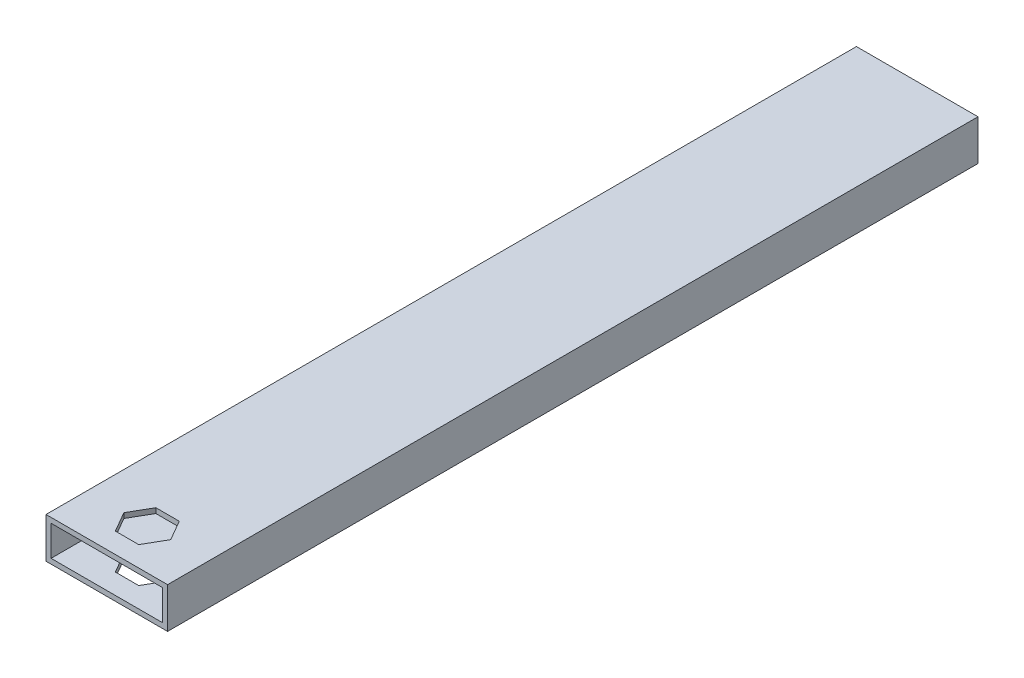
ISO-10303-21;
HEADER;
FILE_DESCRIPTION(('STEP AP214'),'2;1');
FILE_NAME('part.step','',(''),(''),'','','');
FILE_SCHEMA(('AUTOMOTIVE_DESIGN { 1 0 10303 214 1 1 1 1 }'));
ENDSEC;
DATA;
#1=APPLICATION_CONTEXT('core data for automotive mechanical design processes');
#2=APPLICATION_PROTOCOL_DEFINITION('international standard','automotive_design',2000,#1);
#3=PRODUCT_CONTEXT('',#1,'mechanical');
#4=PRODUCT('Part','Part','',(#3));
#5=PRODUCT_RELATED_PRODUCT_CATEGORY('part','',(#4));
#6=PRODUCT_DEFINITION_FORMATION('','',#4);
#7=PRODUCT_DEFINITION_CONTEXT('part definition',#1,'design');
#8=PRODUCT_DEFINITION('design','',#6,#7);
#9=PRODUCT_DEFINITION_SHAPE('','',#8);
#10=(LENGTH_UNIT() NAMED_UNIT(*) SI_UNIT(.MILLI.,.METRE.));
#11=(NAMED_UNIT(*) PLANE_ANGLE_UNIT() SI_UNIT($,.RADIAN.));
#12=(NAMED_UNIT(*) SI_UNIT($,.STERADIAN.) SOLID_ANGLE_UNIT());
#13=UNCERTAINTY_MEASURE_WITH_UNIT(LENGTH_MEASURE(1.E-05),#10,'distance_accuracy_value','');
#14=(GEOMETRIC_REPRESENTATION_CONTEXT(3) GLOBAL_UNCERTAINTY_ASSIGNED_CONTEXT((#13)) GLOBAL_UNIT_ASSIGNED_CONTEXT((#10,
#11,#12)) REPRESENTATION_CONTEXT('',''));
#15=CARTESIAN_POINT('',(0.,0.,0.));
#16=DIRECTION('',(0.,0.,1.));
#17=DIRECTION('',(1.,0.,0.));
#18=AXIS2_PLACEMENT_3D('',#15,#16,#17);
#19=CARTESIAN_POINT('',(0.,0.,254.));
#20=DIRECTION('',(1.,0.,0.));
#21=DIRECTION('',(0.,0.,-1.));
#22=AXIS2_PLACEMENT_3D('',#19,#20,#21);
#23=PLANE('',#22);
#24=DIRECTION('',(0.,-1.,0.));
#25=VECTOR('',#24,1.);
#26=CARTESIAN_POINT('',(0.,0.,0.));
#27=LINE('',#26,#25);
#28=CARTESIAN_POINT('',(0.,12.7,0.));
#29=VERTEX_POINT('',#28);
#30=CARTESIAN_POINT('',(0.,0.,0.));
#31=VERTEX_POINT('',#30);
#32=EDGE_CURVE('E279',#29,#31,#27,.T.);
#33=ORIENTED_EDGE('',*,*,#32,.T.);
#34=DIRECTION('',(0.,0.,-1.));
#35=VECTOR('',#34,1.);
#36=CARTESIAN_POINT('',(0.,0.,254.));
#37=LINE('',#36,#35);
#38=CARTESIAN_POINT('',(0.,0.,254.));
#39=VERTEX_POINT('',#38);
#40=EDGE_CURVE('E312',#39,#31,#37,.T.);
#41=ORIENTED_EDGE('',*,*,#40,.F.);
#42=DIRECTION('',(0.,-1.,0.));
#43=VECTOR('',#42,1.);
#44=CARTESIAN_POINT('',(0.,0.,254.));
#45=LINE('',#44,#43);
#46=CARTESIAN_POINT('',(0.,12.7,254.));
#47=VERTEX_POINT('',#46);
#48=EDGE_CURVE('E286',#47,#39,#45,.T.);
#49=ORIENTED_EDGE('',*,*,#48,.F.);
#50=DIRECTION('',(0.,0.,-1.));
#51=VECTOR('',#50,1.);
#52=CARTESIAN_POINT('',(0.,12.7,254.));
#53=LINE('',#52,#51);
#54=EDGE_CURVE('E296',#47,#29,#53,.T.);
#55=ORIENTED_EDGE('',*,*,#54,.T.);
#56=EDGE_LOOP('',(#33,#41,#49,#55));
#57=FACE_BOUND('',#56,.T.);
#58=ADVANCED_FACE('F34',(#57),#23,.F.);
#59=CARTESIAN_POINT('',(0.,0.,254.));
#60=DIRECTION('',(0.,1.,0.));
#61=DIRECTION('',(0.,0.,1.));
#62=AXIS2_PLACEMENT_3D('',#59,#60,#61);
#63=PLANE('',#62);
#64=DIRECTION('',(-0.499999999999999,0.,0.866025403784439));
#65=VECTOR('',#64,1.);
#66=CARTESIAN_POINT('',(26.3823484187083,0.,241.3));
#67=LINE('',#66,#65);
#68=CARTESIAN_POINT('',(26.3823484187083,0.,241.3));
#69=VERTEX_POINT('',#68);
#70=CARTESIAN_POINT('',(22.7161742093541,0.,247.65));
#71=VERTEX_POINT('',#70);
#72=EDGE_CURVE('E211',#69,#71,#67,.T.);
#73=ORIENTED_EDGE('',*,*,#72,.F.);
#74=DIRECTION('',(0.5,0.,0.866025403784439));
#75=VECTOR('',#74,1.);
#76=CARTESIAN_POINT('',(22.7161742093542,0.,234.95));
#77=LINE('',#76,#75);
#78=CARTESIAN_POINT('',(22.7161742093542,0.,234.95));
#79=VERTEX_POINT('',#78);
#80=EDGE_CURVE('E48',#79,#69,#77,.T.);
#81=ORIENTED_EDGE('',*,*,#80,.F.);
#82=DIRECTION('',(1.,0.,0.));
#83=VECTOR('',#82,1.);
#84=CARTESIAN_POINT('',(15.3838257906459,0.,234.95));
#85=LINE('',#84,#83);
#86=CARTESIAN_POINT('',(15.3838257906459,0.,234.95));
#87=VERTEX_POINT('',#86);
#88=EDGE_CURVE('E197',#87,#79,#85,.T.);
#89=ORIENTED_EDGE('',*,*,#88,.F.);
#90=DIRECTION('',(0.5,0.,-0.866025403784438));
#91=VECTOR('',#90,1.);
#92=CARTESIAN_POINT('',(11.7176515812918,0.,241.3));
#93=LINE('',#92,#91);
#94=CARTESIAN_POINT('',(11.7176515812918,0.,241.3));
#95=VERTEX_POINT('',#94);
#96=EDGE_CURVE('E200',#95,#87,#93,.T.);
#97=ORIENTED_EDGE('',*,*,#96,.F.);
#98=DIRECTION('',(-0.499999999999999,0.,-0.866025403784439));
#99=VECTOR('',#98,1.);
#100=CARTESIAN_POINT('',(15.3838257906459,0.,247.65));
#101=LINE('',#100,#99);
#102=CARTESIAN_POINT('',(15.3838257906459,0.,247.65));
#103=VERTEX_POINT('',#102);
#104=EDGE_CURVE('E217',#103,#95,#101,.T.);
#105=ORIENTED_EDGE('',*,*,#104,.F.);
#106=DIRECTION('',(-1.,0.,0.));
#107=VECTOR('',#106,1.);
#108=CARTESIAN_POINT('',(22.7161742093541,0.,247.65));
#109=LINE('',#108,#107);
#110=EDGE_CURVE('E214',#71,#103,#109,.T.);
#111=ORIENTED_EDGE('',*,*,#110,.F.);
#112=EDGE_LOOP('',(#73,#81,#89,#97,#105,#111));
#113=FACE_BOUND('',#112,.T.);
#114=DIRECTION('',(1.,0.,0.));
#115=VECTOR('',#114,1.);
#116=CARTESIAN_POINT('',(0.,0.,0.));
#117=LINE('',#116,#115);
#118=CARTESIAN_POINT('',(38.1,0.,0.));
#119=VERTEX_POINT('',#118);
#120=EDGE_CURVE('E299',#31,#119,#117,.T.);
#121=ORIENTED_EDGE('',*,*,#120,.T.);
#122=DIRECTION('',(0.,0.,-1.));
#123=VECTOR('',#122,1.);
#124=CARTESIAN_POINT('',(38.1,0.,254.));
#125=LINE('',#124,#123);
#126=CARTESIAN_POINT('',(38.1,0.,254.));
#127=VERTEX_POINT('',#126);
#128=EDGE_CURVE('E309',#127,#119,#125,.T.);
#129=ORIENTED_EDGE('',*,*,#128,.F.);
#130=DIRECTION('',(1.,0.,0.));
#131=VECTOR('',#130,1.);
#132=CARTESIAN_POINT('',(0.,0.,254.));
#133=LINE('',#132,#131);
#134=EDGE_CURVE('E289',#39,#127,#133,.T.);
#135=ORIENTED_EDGE('',*,*,#134,.F.);
#136=ORIENTED_EDGE('',*,*,#40,.T.);
#137=EDGE_LOOP('',(#121,#129,#135,#136));
#138=FACE_BOUND('',#137,.T.);
#139=ADVANCED_FACE('F342',(#113,#138),#63,.F.);
#140=CARTESIAN_POINT('',(38.1,0.,254.));
#141=DIRECTION('',(-1.,0.,0.));
#142=DIRECTION('',(0.,0.,1.));
#143=AXIS2_PLACEMENT_3D('',#140,#141,#142);
#144=PLANE('',#143);
#145=DIRECTION('',(0.,1.,0.));
#146=VECTOR('',#145,1.);
#147=CARTESIAN_POINT('',(38.1,0.,0.));
#148=LINE('',#147,#146);
#149=CARTESIAN_POINT('',(38.1,12.7,0.));
#150=VERTEX_POINT('',#149);
#151=EDGE_CURVE('E301',#119,#150,#148,.T.);
#152=ORIENTED_EDGE('',*,*,#151,.T.);
#153=DIRECTION('',(0.,0.,-1.));
#154=VECTOR('',#153,1.);
#155=CARTESIAN_POINT('',(38.1,12.7,254.));
#156=LINE('',#155,#154);
#157=CARTESIAN_POINT('',(38.1,12.7,254.));
#158=VERTEX_POINT('',#157);
#159=EDGE_CURVE('E306',#158,#150,#156,.T.);
#160=ORIENTED_EDGE('',*,*,#159,.F.);
#161=DIRECTION('',(0.,1.,0.));
#162=VECTOR('',#161,1.);
#163=CARTESIAN_POINT('',(38.1,0.,254.));
#164=LINE('',#163,#162);
#165=EDGE_CURVE('E292',#127,#158,#164,.T.);
#166=ORIENTED_EDGE('',*,*,#165,.F.);
#167=ORIENTED_EDGE('',*,*,#128,.T.);
#168=EDGE_LOOP('',(#152,#160,#166,#167));
#169=FACE_BOUND('',#168,.T.);
#170=ADVANCED_FACE('F364',(#169),#144,.F.);
#171=CARTESIAN_POINT('',(0.,12.7,254.));
#172=DIRECTION('',(0.,-1.,0.));
#173=DIRECTION('',(0.,0.,-1.));
#174=AXIS2_PLACEMENT_3D('',#171,#172,#173);
#175=PLANE('',#174);
#176=DIRECTION('',(1.,0.,0.));
#177=VECTOR('',#176,1.);
#178=CARTESIAN_POINT('',(15.3838257906459,12.7,234.95));
#179=LINE('',#178,#177);
#180=CARTESIAN_POINT('',(15.3838257906459,12.7,234.95));
#181=VERTEX_POINT('',#180);
#182=CARTESIAN_POINT('',(22.7161742093542,12.7,234.95));
#183=VERTEX_POINT('',#182);
#184=EDGE_CURVE('E196',#181,#183,#179,.T.);
#185=ORIENTED_EDGE('',*,*,#184,.T.);
#186=DIRECTION('',(0.5,0.,0.866025403784439));
#187=VECTOR('',#186,1.);
#188=CARTESIAN_POINT('',(22.7161742093542,12.7,234.95));
#189=LINE('',#188,#187);
#190=CARTESIAN_POINT('',(26.3823484187083,12.7,241.3));
#191=VERTEX_POINT('',#190);
#192=EDGE_CURVE('E177',#183,#191,#189,.T.);
#193=ORIENTED_EDGE('',*,*,#192,.T.);
#194=DIRECTION('',(-0.499999999999999,0.,0.866025403784439));
#195=VECTOR('',#194,1.);
#196=CARTESIAN_POINT('',(26.3823484187083,12.7,241.3));
#197=LINE('',#196,#195);
#198=CARTESIAN_POINT('',(22.7161742093541,12.7,247.65));
#199=VERTEX_POINT('',#198);
#200=EDGE_CURVE('E187',#191,#199,#197,.T.);
#201=ORIENTED_EDGE('',*,*,#200,.T.);
#202=DIRECTION('',(-1.,0.,0.));
#203=VECTOR('',#202,1.);
#204=CARTESIAN_POINT('',(22.7161742093541,12.7,247.65));
#205=LINE('',#204,#203);
#206=CARTESIAN_POINT('',(15.3838257906459,12.7,247.65));
#207=VERTEX_POINT('',#206);
#208=EDGE_CURVE('E56',#199,#207,#205,.T.);
#209=ORIENTED_EDGE('',*,*,#208,.T.);
#210=DIRECTION('',(-0.499999999999999,0.,-0.866025403784439));
#211=VECTOR('',#210,1.);
#212=CARTESIAN_POINT('',(15.3838257906459,12.7,247.65));
#213=LINE('',#212,#211);
#214=CARTESIAN_POINT('',(11.7176515812918,12.7,241.3));
#215=VERTEX_POINT('',#214);
#216=EDGE_CURVE('E204',#207,#215,#213,.T.);
#217=ORIENTED_EDGE('',*,*,#216,.T.);
#218=DIRECTION('',(0.5,0.,-0.866025403784438));
#219=VECTOR('',#218,1.);
#220=CARTESIAN_POINT('',(11.7176515812918,12.7,241.3));
#221=LINE('',#220,#219);
#222=EDGE_CURVE('E207',#215,#181,#221,.T.);
#223=ORIENTED_EDGE('',*,*,#222,.T.);
#224=EDGE_LOOP('',(#185,#193,#201,#209,#217,#223));
#225=FACE_BOUND('',#224,.T.);
#226=DIRECTION('',(-1.,0.,0.));
#227=VECTOR('',#226,1.);
#228=CARTESIAN_POINT('',(0.,12.7,0.));
#229=LINE('',#228,#227);
#230=EDGE_CURVE('E290',#150,#29,#229,.T.);
#231=ORIENTED_EDGE('',*,*,#230,.T.);
#232=ORIENTED_EDGE('',*,*,#54,.F.);
#233=DIRECTION('',(-1.,0.,0.));
#234=VECTOR('',#233,1.);
#235=CARTESIAN_POINT('',(0.,12.7,254.));
#236=LINE('',#235,#234);
#237=EDGE_CURVE('E294',#158,#47,#236,.T.);
#238=ORIENTED_EDGE('',*,*,#237,.F.);
#239=ORIENTED_EDGE('',*,*,#159,.T.);
#240=EDGE_LOOP('',(#231,#232,#238,#239));
#241=FACE_BOUND('',#240,.T.);
#242=ADVANCED_FACE('F192',(#225,#241),#175,.F.);
#243=CARTESIAN_POINT('',(0.,0.,254.));
#244=DIRECTION('',(0.,0.,-1.));
#245=DIRECTION('',(-1.,0.,0.));
#246=AXIS2_PLACEMENT_3D('',#243,#244,#245);
#247=PLANE('',#246);
#248=DIRECTION('',(0.,-1.,0.));
#249=VECTOR('',#248,1.);
#250=CARTESIAN_POINT('',(1.5875,11.1125,254.));
#251=LINE('',#250,#249);
#252=CARTESIAN_POINT('',(1.5875,11.1125,254.));
#253=VERTEX_POINT('',#252);
#254=CARTESIAN_POINT('',(1.5875,1.5875,254.));
#255=VERTEX_POINT('',#254);
#256=EDGE_CURVE('E269',#253,#255,#251,.T.);
#257=ORIENTED_EDGE('',*,*,#256,.F.);
#258=DIRECTION('',(-1.,0.,0.));
#259=VECTOR('',#258,1.);
#260=CARTESIAN_POINT('',(36.5125,11.1125,254.));
#261=LINE('',#260,#259);
#262=CARTESIAN_POINT('',(36.5125,11.1125,254.));
#263=VERTEX_POINT('',#262);
#264=EDGE_CURVE('E253',#263,#253,#261,.T.);
#265=ORIENTED_EDGE('',*,*,#264,.F.);
#266=DIRECTION('',(0.,1.,0.));
#267=VECTOR('',#266,1.);
#268=CARTESIAN_POINT('',(36.5125,1.5875,254.));
#269=LINE('',#268,#267);
#270=CARTESIAN_POINT('',(36.5125,1.5875,254.));
#271=VERTEX_POINT('',#270);
#272=EDGE_CURVE('E258',#271,#263,#269,.T.);
#273=ORIENTED_EDGE('',*,*,#272,.F.);
#274=DIRECTION('',(1.,0.,0.));
#275=VECTOR('',#274,1.);
#276=CARTESIAN_POINT('',(1.5875,1.5875,254.));
#277=LINE('',#276,#275);
#278=EDGE_CURVE('E272',#255,#271,#277,.T.);
#279=ORIENTED_EDGE('',*,*,#278,.F.);
#280=EDGE_LOOP('',(#257,#265,#273,#279));
#281=FACE_BOUND('',#280,.T.);
#282=ORIENTED_EDGE('',*,*,#48,.T.);
#283=ORIENTED_EDGE('',*,*,#134,.T.);
#284=ORIENTED_EDGE('',*,*,#165,.T.);
#285=ORIENTED_EDGE('',*,*,#237,.T.);
#286=EDGE_LOOP('',(#282,#283,#284,#285));
#287=FACE_BOUND('',#286,.T.);
#288=ADVANCED_FACE('F376',(#281,#287),#247,.F.);
#289=CARTESIAN_POINT('',(0.,0.,0.));
#290=DIRECTION('',(0.,0.,-1.));
#291=DIRECTION('',(-1.,0.,0.));
#292=AXIS2_PLACEMENT_3D('',#289,#290,#291);
#293=PLANE('',#292);
#294=DIRECTION('',(-1.,0.,0.));
#295=VECTOR('',#294,1.);
#296=CARTESIAN_POINT('',(36.5125,11.1125,0.));
#297=LINE('',#296,#295);
#298=CARTESIAN_POINT('',(36.5125,11.1125,0.));
#299=VERTEX_POINT('',#298);
#300=CARTESIAN_POINT('',(1.5875,11.1125,0.));
#301=VERTEX_POINT('',#300);
#302=EDGE_CURVE('E254',#299,#301,#297,.T.);
#303=ORIENTED_EDGE('',*,*,#302,.T.);
#304=DIRECTION('',(0.,-1.,0.));
#305=VECTOR('',#304,1.);
#306=CARTESIAN_POINT('',(1.5875,11.1125,0.));
#307=LINE('',#306,#305);
#308=CARTESIAN_POINT('',(1.5875,1.5875,0.));
#309=VERTEX_POINT('',#308);
#310=EDGE_CURVE('E257',#301,#309,#307,.T.);
#311=ORIENTED_EDGE('',*,*,#310,.T.);
#312=DIRECTION('',(1.,0.,0.));
#313=VECTOR('',#312,1.);
#314=CARTESIAN_POINT('',(1.5875,1.5875,0.));
#315=LINE('',#314,#313);
#316=CARTESIAN_POINT('',(36.5125,1.5875,0.));
#317=VERTEX_POINT('',#316);
#318=EDGE_CURVE('E261',#309,#317,#315,.T.);
#319=ORIENTED_EDGE('',*,*,#318,.T.);
#320=DIRECTION('',(0.,1.,0.));
#321=VECTOR('',#320,1.);
#322=CARTESIAN_POINT('',(36.5125,1.5875,0.));
#323=LINE('',#322,#321);
#324=EDGE_CURVE('E264',#317,#299,#323,.T.);
#325=ORIENTED_EDGE('',*,*,#324,.T.);
#326=EDGE_LOOP('',(#303,#311,#319,#325));
#327=FACE_BOUND('',#326,.T.);
#328=ORIENTED_EDGE('',*,*,#32,.F.);
#329=ORIENTED_EDGE('',*,*,#230,.F.);
#330=ORIENTED_EDGE('',*,*,#151,.F.);
#331=ORIENTED_EDGE('',*,*,#120,.F.);
#332=EDGE_LOOP('',(#328,#329,#330,#331));
#333=FACE_BOUND('',#332,.T.);
#334=ADVANCED_FACE('F371',(#327,#333),#293,.T.);
#335=CARTESIAN_POINT('',(36.5125,11.1125,0.));
#336=DIRECTION('',(0.,1.,0.));
#337=DIRECTION('',(0.,0.,1.));
#338=AXIS2_PLACEMENT_3D('',#335,#336,#337);
#339=PLANE('',#338);
#340=DIRECTION('',(0.499999999999999,0.,-0.866025403784439));
#341=VECTOR('',#340,1.);
#342=CARTESIAN_POINT('',(133.400851280624,11.1125,55.938515693207));
#343=LINE('',#342,#341);
#344=CARTESIAN_POINT('',(22.7161742093541,11.1125,247.65));
#345=VERTEX_POINT('',#344);
#346=CARTESIAN_POINT('',(26.3823484187082,11.1125,241.3));
#347=VERTEX_POINT('',#346);
#348=EDGE_CURVE('E224',#345,#347,#343,.T.);
#349=ORIENTED_EDGE('',*,*,#348,.T.);
#350=DIRECTION('',(-0.5,0.,-0.866025403784439));
#351=VECTOR('',#350,1.);
#352=CARTESIAN_POINT('',(-75.5710786525614,11.1125,64.7114843067929));
#353=LINE('',#352,#351);
#354=CARTESIAN_POINT('',(22.7161742093542,11.1125,234.95));
#355=VERTEX_POINT('',#354);
#356=EDGE_CURVE('E180',#347,#355,#353,.T.);
#357=ORIENTED_EDGE('',*,*,#356,.T.);
#358=DIRECTION('',(-1.,0.,0.));
#359=VECTOR('',#358,1.);
#360=CARTESIAN_POINT('',(36.5125,11.1125,234.95));
#361=LINE('',#360,#359);
#362=CARTESIAN_POINT('',(15.3838257906459,11.1125,234.95));
#363=VERTEX_POINT('',#362);
#364=EDGE_CURVE('E249',#355,#363,#361,.T.);
#365=ORIENTED_EDGE('',*,*,#364,.T.);
#366=DIRECTION('',(-0.5,0.,0.866025403784439));
#367=VECTOR('',#366,1.);
#368=CARTESIAN_POINT('',(122.402328652561,11.1125,49.5885156932072));
#369=LINE('',#368,#367);
#370=CARTESIAN_POINT('',(11.7176515812918,11.1125,241.3));
#371=VERTEX_POINT('',#370);
#372=EDGE_CURVE('E246',#363,#371,#369,.T.);
#373=ORIENTED_EDGE('',*,*,#372,.T.);
#374=DIRECTION('',(0.499999999999999,0.,0.866025403784439));
#375=VECTOR('',#374,1.);
#376=CARTESIAN_POINT('',(-86.5696012806236,11.1125,71.0614843067926));
#377=LINE('',#376,#375);
#378=CARTESIAN_POINT('',(15.3838257906459,11.1125,247.65));
#379=VERTEX_POINT('',#378);
#380=EDGE_CURVE('E243',#371,#379,#377,.T.);
#381=ORIENTED_EDGE('',*,*,#380,.T.);
#382=DIRECTION('',(1.,0.,0.));
#383=VECTOR('',#382,1.);
#384=CARTESIAN_POINT('',(36.5125,11.1125,247.65));
#385=LINE('',#384,#383);
#386=EDGE_CURVE('E240',#379,#345,#385,.T.);
#387=ORIENTED_EDGE('',*,*,#386,.T.);
#388=EDGE_LOOP('',(#349,#357,#365,#373,#381,#387));
#389=FACE_BOUND('',#388,.T.);
#390=ORIENTED_EDGE('',*,*,#264,.T.);
#391=DIRECTION('',(0.,0.,1.));
#392=VECTOR('',#391,1.);
#393=CARTESIAN_POINT('',(1.5875,11.1125,0.));
#394=LINE('',#393,#392);
#395=EDGE_CURVE('E267',#301,#253,#394,.T.);
#396=ORIENTED_EDGE('',*,*,#395,.F.);
#397=ORIENTED_EDGE('',*,*,#302,.F.);
#398=DIRECTION('',(0.,0.,1.));
#399=VECTOR('',#398,1.);
#400=CARTESIAN_POINT('',(36.5125,11.1125,0.));
#401=LINE('',#400,#399);
#402=EDGE_CURVE('E277',#299,#263,#401,.T.);
#403=ORIENTED_EDGE('',*,*,#402,.T.);
#404=EDGE_LOOP('',(#390,#396,#397,#403));
#405=FACE_BOUND('',#404,.T.);
#406=ADVANCED_FACE('F389',(#389,#405),#339,.F.);
#407=CARTESIAN_POINT('',(36.5125,1.5875,0.));
#408=DIRECTION('',(1.,0.,0.));
#409=DIRECTION('',(0.,0.,-1.));
#410=AXIS2_PLACEMENT_3D('',#407,#408,#409);
#411=PLANE('',#410);
#412=ORIENTED_EDGE('',*,*,#272,.T.);
#413=ORIENTED_EDGE('',*,*,#402,.F.);
#414=ORIENTED_EDGE('',*,*,#324,.F.);
#415=DIRECTION('',(0.,0.,1.));
#416=VECTOR('',#415,1.);
#417=CARTESIAN_POINT('',(36.5125,1.5875,0.));
#418=LINE('',#417,#416);
#419=EDGE_CURVE('E280',#317,#271,#418,.T.);
#420=ORIENTED_EDGE('',*,*,#419,.T.);
#421=EDGE_LOOP('',(#412,#413,#414,#420));
#422=FACE_BOUND('',#421,.T.);
#423=ADVANCED_FACE('F396',(#422),#411,.F.);
#424=CARTESIAN_POINT('',(1.5875,1.5875,0.));
#425=DIRECTION('',(0.,-1.,0.));
#426=DIRECTION('',(0.,0.,-1.));
#427=AXIS2_PLACEMENT_3D('',#424,#425,#426);
#428=PLANE('',#427);
#429=DIRECTION('',(1.,0.,0.));
#430=VECTOR('',#429,1.);
#431=CARTESIAN_POINT('',(1.5875,1.5875,234.95));
#432=LINE('',#431,#430);
#433=CARTESIAN_POINT('',(15.3838257906459,1.5875,234.95));
#434=VERTEX_POINT('',#433);
#435=CARTESIAN_POINT('',(22.7161742093542,1.5875,234.95));
#436=VERTEX_POINT('',#435);
#437=EDGE_CURVE('E41',#434,#436,#432,.T.);
#438=ORIENTED_EDGE('',*,*,#437,.T.);
#439=DIRECTION('',(0.5,0.,0.866025403784439));
#440=VECTOR('',#439,1.);
#441=CARTESIAN_POINT('',(-84.3023286525614,1.5875,49.5885156932072));
#442=LINE('',#441,#440);
#443=CARTESIAN_POINT('',(26.3823484187083,1.5875,241.3));
#444=VERTEX_POINT('',#443);
#445=EDGE_CURVE('E11',#436,#444,#442,.T.);
#446=ORIENTED_EDGE('',*,*,#445,.T.);
#447=DIRECTION('',(-0.499999999999999,0.,0.866025403784439));
#448=VECTOR('',#447,1.);
#449=CARTESIAN_POINT('',(124.669601280624,1.5875,71.0614843067927));
#450=LINE('',#449,#448);
#451=CARTESIAN_POINT('',(22.7161742093542,1.5875,247.65));
#452=VERTEX_POINT('',#451);
#453=EDGE_CURVE('E315',#444,#452,#450,.T.);
#454=ORIENTED_EDGE('',*,*,#453,.T.);
#455=DIRECTION('',(-1.,0.,0.));
#456=VECTOR('',#455,1.);
#457=CARTESIAN_POINT('',(1.5875,1.5875,247.65));
#458=LINE('',#457,#456);
#459=CARTESIAN_POINT('',(15.3838257906459,1.5875,247.65));
#460=VERTEX_POINT('',#459);
#461=EDGE_CURVE('E318',#452,#460,#458,.T.);
#462=ORIENTED_EDGE('',*,*,#461,.T.);
#463=DIRECTION('',(-0.499999999999999,0.,-0.866025403784439));
#464=VECTOR('',#463,1.);
#465=CARTESIAN_POINT('',(-95.3008512806236,1.5875,55.9385156932069));
#466=LINE('',#465,#464);
#467=CARTESIAN_POINT('',(11.7176515812918,1.5875,241.3));
#468=VERTEX_POINT('',#467);
#469=EDGE_CURVE('E321',#460,#468,#466,.T.);
#470=ORIENTED_EDGE('',*,*,#469,.T.);
#471=DIRECTION('',(0.5,0.,-0.866025403784439));
#472=VECTOR('',#471,1.);
#473=CARTESIAN_POINT('',(113.671078652561,1.5875,64.711484306793));
#474=LINE('',#473,#472);
#475=EDGE_CURVE('E324',#468,#434,#474,.T.);
#476=ORIENTED_EDGE('',*,*,#475,.T.);
#477=EDGE_LOOP('',(#438,#446,#454,#462,#470,#476));
#478=FACE_BOUND('',#477,.T.);
#479=ORIENTED_EDGE('',*,*,#278,.T.);
#480=ORIENTED_EDGE('',*,*,#419,.F.);
#481=ORIENTED_EDGE('',*,*,#318,.F.);
#482=DIRECTION('',(0.,0.,1.));
#483=VECTOR('',#482,1.);
#484=CARTESIAN_POINT('',(1.5875,1.5875,0.));
#485=LINE('',#484,#483);
#486=EDGE_CURVE('E282',#309,#255,#485,.T.);
#487=ORIENTED_EDGE('',*,*,#486,.T.);
#488=EDGE_LOOP('',(#479,#480,#481,#487));
#489=FACE_BOUND('',#488,.T.);
#490=ADVANCED_FACE('F328',(#478,#489),#428,.F.);
#491=CARTESIAN_POINT('',(1.5875,11.1125,0.));
#492=DIRECTION('',(-1.,0.,0.));
#493=DIRECTION('',(0.,0.,1.));
#494=AXIS2_PLACEMENT_3D('',#491,#492,#493);
#495=PLANE('',#494);
#496=ORIENTED_EDGE('',*,*,#256,.T.);
#497=ORIENTED_EDGE('',*,*,#486,.F.);
#498=ORIENTED_EDGE('',*,*,#310,.F.);
#499=ORIENTED_EDGE('',*,*,#395,.T.);
#500=EDGE_LOOP('',(#496,#497,#498,#499));
#501=FACE_BOUND('',#500,.T.);
#502=ADVANCED_FACE('F398',(#501),#495,.F.);
#503=CARTESIAN_POINT('',(26.3823484187083,12.7,241.3));
#504=DIRECTION('',(0.866025403784439,0.,0.5));
#505=DIRECTION('',(0.499999999999999,0.,-0.866025403784439));
#506=AXIS2_PLACEMENT_3D('',#503,#504,#505);
#507=PLANE('',#506);
#508=DIRECTION('',(0.,-1.,0.));
#509=VECTOR('',#508,1.);
#510=CARTESIAN_POINT('',(26.3823484187083,12.7,241.3));
#511=LINE('',#510,#509);
#512=EDGE_CURVE('E184',#444,#69,#511,.T.);
#513=ORIENTED_EDGE('',*,*,#512,.T.);
#514=ORIENTED_EDGE('',*,*,#72,.T.);
#515=DIRECTION('',(0.,-1.,0.));
#516=VECTOR('',#515,1.);
#517=CARTESIAN_POINT('',(22.7161742093541,12.7,247.65));
#518=LINE('',#517,#516);
#519=EDGE_CURVE('E183',#452,#71,#518,.T.);
#520=ORIENTED_EDGE('',*,*,#519,.F.);
#521=ORIENTED_EDGE('',*,*,#453,.F.);
#522=EDGE_LOOP('',(#513,#514,#520,#521));
#523=FACE_BOUND('',#522,.T.);
#524=ADVANCED_FACE('F346',(#523),#507,.F.);
#525=CARTESIAN_POINT('',(22.7161742093541,12.7,247.65));
#526=DIRECTION('',(0.,0.,1.));
#527=DIRECTION('',(1.,0.,0.));
#528=AXIS2_PLACEMENT_3D('',#525,#526,#527);
#529=PLANE('',#528);
#530=ORIENTED_EDGE('',*,*,#519,.T.);
#531=ORIENTED_EDGE('',*,*,#110,.T.);
#532=DIRECTION('',(0.,-1.,0.));
#533=VECTOR('',#532,1.);
#534=CARTESIAN_POINT('',(15.3838257906459,12.7,247.65));
#535=LINE('',#534,#533);
#536=EDGE_CURVE('E237',#460,#103,#535,.T.);
#537=ORIENTED_EDGE('',*,*,#536,.F.);
#538=ORIENTED_EDGE('',*,*,#461,.F.);
#539=EDGE_LOOP('',(#530,#531,#537,#538));
#540=FACE_BOUND('',#539,.T.);
#541=ADVANCED_FACE('F434',(#540),#529,.F.);
#542=CARTESIAN_POINT('',(15.3838257906459,12.7,247.65));
#543=DIRECTION('',(-0.866025403784439,0.,0.499999999999999));
#544=DIRECTION('',(0.499999999999999,0.,0.866025403784439));
#545=AXIS2_PLACEMENT_3D('',#542,#543,#544);
#546=PLANE('',#545);
#547=ORIENTED_EDGE('',*,*,#536,.T.);
#548=ORIENTED_EDGE('',*,*,#104,.T.);
#549=DIRECTION('',(0.,-1.,0.));
#550=VECTOR('',#549,1.);
#551=CARTESIAN_POINT('',(11.7176515812918,12.7,241.3));
#552=LINE('',#551,#550);
#553=EDGE_CURVE('E233',#468,#95,#552,.T.);
#554=ORIENTED_EDGE('',*,*,#553,.F.);
#555=ORIENTED_EDGE('',*,*,#469,.F.);
#556=EDGE_LOOP('',(#547,#548,#554,#555));
#557=FACE_BOUND('',#556,.T.);
#558=ADVANCED_FACE('F440',(#557),#546,.F.);
#559=CARTESIAN_POINT('',(11.7176515812918,12.7,241.3));
#560=DIRECTION('',(-0.866025403784439,0.,-0.5));
#561=DIRECTION('',(-0.5,0.,0.866025403784439));
#562=AXIS2_PLACEMENT_3D('',#559,#560,#561);
#563=PLANE('',#562);
#564=ORIENTED_EDGE('',*,*,#553,.T.);
#565=ORIENTED_EDGE('',*,*,#96,.T.);
#566=DIRECTION('',(0.,-1.,0.));
#567=VECTOR('',#566,1.);
#568=CARTESIAN_POINT('',(15.3838257906459,12.7,234.95));
#569=LINE('',#568,#567);
#570=EDGE_CURVE('E229',#434,#87,#569,.T.);
#571=ORIENTED_EDGE('',*,*,#570,.F.);
#572=ORIENTED_EDGE('',*,*,#475,.F.);
#573=EDGE_LOOP('',(#564,#565,#571,#572));
#574=FACE_BOUND('',#573,.T.);
#575=ADVANCED_FACE('F335',(#574),#563,.F.);
#576=CARTESIAN_POINT('',(15.3838257906459,12.7,234.95));
#577=DIRECTION('',(0.,0.,-1.));
#578=DIRECTION('',(-1.,0.,0.));
#579=AXIS2_PLACEMENT_3D('',#576,#577,#578);
#580=PLANE('',#579);
#581=ORIENTED_EDGE('',*,*,#570,.T.);
#582=ORIENTED_EDGE('',*,*,#88,.T.);
#583=DIRECTION('',(0.,-1.,0.));
#584=VECTOR('',#583,1.);
#585=CARTESIAN_POINT('',(22.7161742093542,12.7,234.95));
#586=LINE('',#585,#584);
#587=EDGE_CURVE('E225',#436,#79,#586,.T.);
#588=ORIENTED_EDGE('',*,*,#587,.F.);
#589=ORIENTED_EDGE('',*,*,#437,.F.);
#590=EDGE_LOOP('',(#581,#582,#588,#589));
#591=FACE_BOUND('',#590,.T.);
#592=ADVANCED_FACE('F333',(#591),#580,.F.);
#593=CARTESIAN_POINT('',(22.7161742093542,12.7,234.95));
#594=DIRECTION('',(0.866025403784438,0.,-0.5));
#595=DIRECTION('',(-0.5,0.,-0.866025403784439));
#596=AXIS2_PLACEMENT_3D('',#593,#594,#595);
#597=PLANE('',#596);
#598=ORIENTED_EDGE('',*,*,#587,.T.);
#599=ORIENTED_EDGE('',*,*,#80,.T.);
#600=ORIENTED_EDGE('',*,*,#512,.F.);
#601=ORIENTED_EDGE('',*,*,#445,.F.);
#602=EDGE_LOOP('',(#598,#599,#600,#601));
#603=FACE_BOUND('',#602,.T.);
#604=ADVANCED_FACE('F348',(#603),#597,.F.);
#605=EDGE_CURVE('E172',#191,#347,#511,.T.);
#606=ORIENTED_EDGE('',*,*,#605,.F.);
#607=ORIENTED_EDGE('',*,*,#192,.F.);
#608=EDGE_CURVE('E222',#183,#355,#586,.T.);
#609=ORIENTED_EDGE('',*,*,#608,.T.);
#610=ORIENTED_EDGE('',*,*,#356,.F.);
#611=EDGE_LOOP('',(#606,#607,#609,#610));
#612=FACE_BOUND('',#611,.T.);
#613=ADVANCED_FACE('F174',(#612),#597,.F.);
#614=ORIENTED_EDGE('',*,*,#608,.F.);
#615=ORIENTED_EDGE('',*,*,#184,.F.);
#616=EDGE_CURVE('E226',#181,#363,#569,.T.);
#617=ORIENTED_EDGE('',*,*,#616,.T.);
#618=ORIENTED_EDGE('',*,*,#364,.F.);
#619=EDGE_LOOP('',(#614,#615,#617,#618));
#620=FACE_BOUND('',#619,.T.);
#621=ADVANCED_FACE('F355',(#620),#580,.F.);
#622=ORIENTED_EDGE('',*,*,#616,.F.);
#623=ORIENTED_EDGE('',*,*,#222,.F.);
#624=EDGE_CURVE('E230',#215,#371,#552,.T.);
#625=ORIENTED_EDGE('',*,*,#624,.T.);
#626=ORIENTED_EDGE('',*,*,#372,.F.);
#627=EDGE_LOOP('',(#622,#623,#625,#626));
#628=FACE_BOUND('',#627,.T.);
#629=ADVANCED_FACE('F457',(#628),#563,.F.);
#630=ORIENTED_EDGE('',*,*,#624,.F.);
#631=ORIENTED_EDGE('',*,*,#216,.F.);
#632=EDGE_CURVE('E234',#207,#379,#535,.T.);
#633=ORIENTED_EDGE('',*,*,#632,.T.);
#634=ORIENTED_EDGE('',*,*,#380,.F.);
#635=EDGE_LOOP('',(#630,#631,#633,#634));
#636=FACE_BOUND('',#635,.T.);
#637=ADVANCED_FACE('F451',(#636),#546,.F.);
#638=ORIENTED_EDGE('',*,*,#632,.F.);
#639=ORIENTED_EDGE('',*,*,#208,.F.);
#640=EDGE_CURVE('E189',#199,#345,#518,.T.);
#641=ORIENTED_EDGE('',*,*,#640,.T.);
#642=ORIENTED_EDGE('',*,*,#386,.F.);
#643=EDGE_LOOP('',(#638,#639,#641,#642));
#644=FACE_BOUND('',#643,.T.);
#645=ADVANCED_FACE('F443',(#644),#529,.F.);
#646=ORIENTED_EDGE('',*,*,#640,.F.);
#647=ORIENTED_EDGE('',*,*,#200,.F.);
#648=ORIENTED_EDGE('',*,*,#605,.T.);
#649=ORIENTED_EDGE('',*,*,#348,.F.);
#650=EDGE_LOOP('',(#646,#647,#648,#649));
#651=FACE_BOUND('',#650,.T.);
#652=ADVANCED_FACE('F188',(#651),#507,.F.);
#653=CLOSED_SHELL('',(#58,#139,#170,#242,#288,#334,#406,#423,#490,#502,#524,#541,#558,#575,#592,
#604,#613,#621,#629,#637,#645,#652));
#654=MANIFOLD_SOLID_BREP('B2',#653);
#655=ADVANCED_BREP_SHAPE_REPRESENTATION('',(#18,#654),#14);
#656=SHAPE_DEFINITION_REPRESENTATION(#9,#655);
ENDSEC;
END-ISO-10303-21;
